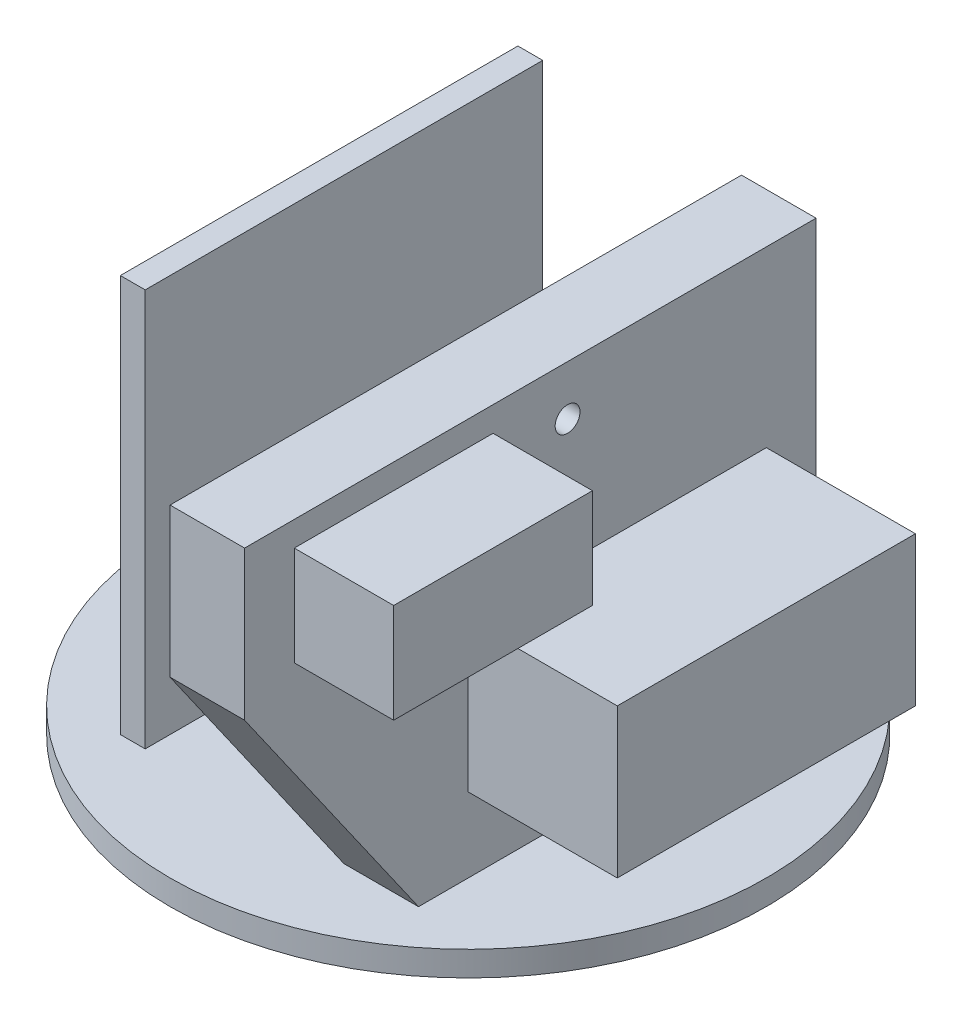
ISO-10303-21;
HEADER;
FILE_DESCRIPTION(('STEP AP214'),'2;1');
FILE_NAME('part.step','',(''),(''),'','','');
FILE_SCHEMA(('AUTOMOTIVE_DESIGN { 1 0 10303 214 1 1 1 1 }'));
ENDSEC;
DATA;
#1=APPLICATION_CONTEXT('core data for automotive mechanical design processes');
#2=APPLICATION_PROTOCOL_DEFINITION('international standard','automotive_design',2000,#1);
#3=PRODUCT_CONTEXT('',#1,'mechanical');
#4=PRODUCT('Part','Part','',(#3));
#5=PRODUCT_RELATED_PRODUCT_CATEGORY('part','',(#4));
#6=PRODUCT_DEFINITION_FORMATION('','',#4);
#7=PRODUCT_DEFINITION_CONTEXT('part definition',#1,'design');
#8=PRODUCT_DEFINITION('design','',#6,#7);
#9=PRODUCT_DEFINITION_SHAPE('','',#8);
#10=(LENGTH_UNIT() NAMED_UNIT(*) SI_UNIT(.MILLI.,.METRE.));
#11=(NAMED_UNIT(*) PLANE_ANGLE_UNIT() SI_UNIT($,.RADIAN.));
#12=(NAMED_UNIT(*) SI_UNIT($,.STERADIAN.) SOLID_ANGLE_UNIT());
#13=UNCERTAINTY_MEASURE_WITH_UNIT(LENGTH_MEASURE(1.E-05),#10,'distance_accuracy_value','');
#14=(GEOMETRIC_REPRESENTATION_CONTEXT(3) GLOBAL_UNCERTAINTY_ASSIGNED_CONTEXT((#13)) GLOBAL_UNIT_ASSIGNED_CONTEXT((#10,
#11,#12)) REPRESENTATION_CONTEXT('',''));
#15=CARTESIAN_POINT('',(0.,0.,0.));
#16=DIRECTION('',(0.,0.,1.));
#17=DIRECTION('',(1.,0.,0.));
#18=AXIS2_PLACEMENT_3D('',#15,#16,#17);
#19=CARTESIAN_POINT('',(15.,69.9999999999999,55.));
#20=DIRECTION('',(-1.,0.,0.));
#21=DIRECTION('',(0.,0.,1.));
#22=AXIS2_PLACEMENT_3D('',#19,#20,#21);
#23=CYLINDRICAL_SURFACE('',#22,2.5);
#24=CARTESIAN_POINT('',(15.,69.9999999999999,55.));
#25=DIRECTION('',(1.,0.,0.));
#26=DIRECTION('',(0.,0.,-1.));
#27=AXIS2_PLACEMENT_3D('',#24,#25,#26);
#28=CIRCLE('',#27,2.5);
#29=CARTESIAN_POINT('',(15.,69.9999999999999,52.5));
#30=VERTEX_POINT('',#29);
#31=EDGE_CURVE('P0_E11',#30,#30,#28,.T.);
#32=ORIENTED_EDGE('',*,*,#31,.F.);
#33=EDGE_LOOP('',(#32));
#34=FACE_BOUND('',#33,.T.);
#35=CARTESIAN_POINT('',(5.,69.9999999999999,55.));
#36=DIRECTION('',(1.,0.,0.));
#37=DIRECTION('',(0.,0.,-1.));
#38=AXIS2_PLACEMENT_3D('',#35,#36,#37);
#39=CIRCLE('',#38,2.5);
#40=CARTESIAN_POINT('',(5.,69.9999999999999,52.5));
#41=VERTEX_POINT('',#40);
#42=EDGE_CURVE('P0_E19',#41,#41,#39,.T.);
#43=ORIENTED_EDGE('',*,*,#42,.T.);
#44=EDGE_LOOP('',(#43));
#45=FACE_BOUND('',#44,.T.);
#46=ADVANCED_FACE('P0_F16',(#34,#45),#23,.T.);
#47=CARTESIAN_POINT('',(5.,69.9999999999999,55.));
#48=DIRECTION('',(1.,0.,0.));
#49=DIRECTION('',(0.,0.,-1.));
#50=AXIS2_PLACEMENT_3D('',#47,#48,#49);
#51=PLANE('',#50);
#52=ORIENTED_EDGE('',*,*,#42,.F.);
#53=EDGE_LOOP('',(#52));
#54=FACE_BOUND('',#53,.T.);
#55=ADVANCED_FACE('P0_F95',(#54),#51,.F.);
#56=CARTESIAN_POINT('',(50.,79.9999999999999,65.));
#57=DIRECTION('',(0.,-1.,0.));
#58=DIRECTION('',(0.,0.,-1.));
#59=AXIS2_PLACEMENT_3D('',#56,#57,#58);
#60=PLANE('',#59);
#61=DIRECTION('',(0.,0.,1.));
#62=VECTOR('',#61,1.);
#63=CARTESIAN_POINT('',(15.,79.9999999999999,65.));
#64=LINE('',#63,#62);
#65=CARTESIAN_POINT('',(15.,79.9999999999999,25.));
#66=VERTEX_POINT('',#65);
#67=CARTESIAN_POINT('',(15.,79.9999999999999,65.));
#68=VERTEX_POINT('',#67);
#69=EDGE_CURVE('P0_E83',#66,#68,#64,.T.);
#70=ORIENTED_EDGE('',*,*,#69,.T.);
#71=DIRECTION('',(-1.,0.,0.));
#72=VECTOR('',#71,1.);
#73=CARTESIAN_POINT('',(50.,79.9999999999999,65.));
#74=LINE('',#73,#72);
#75=CARTESIAN_POINT('',(50.,79.9999999999999,65.));
#76=VERTEX_POINT('',#75);
#77=EDGE_CURVE('P0_E74',#76,#68,#74,.T.);
#78=ORIENTED_EDGE('',*,*,#77,.F.);
#79=DIRECTION('',(0.,0.,1.));
#80=VECTOR('',#79,1.);
#81=CARTESIAN_POINT('',(50.,79.9999999999999,65.));
#82=LINE('',#81,#80);
#83=CARTESIAN_POINT('',(50.,79.9999999999999,25.));
#84=VERTEX_POINT('',#83);
#85=EDGE_CURVE('P0_E68',#84,#76,#82,.T.);
#86=ORIENTED_EDGE('',*,*,#85,.F.);
#87=DIRECTION('',(-1.,0.,0.));
#88=VECTOR('',#87,1.);
#89=CARTESIAN_POINT('',(50.,79.9999999999999,25.));
#90=LINE('',#89,#88);
#91=EDGE_CURVE('P0_E79',#84,#66,#90,.T.);
#92=ORIENTED_EDGE('',*,*,#91,.T.);
#93=EDGE_LOOP('',(#70,#78,#86,#92));
#94=FACE_BOUND('',#93,.T.);
#95=ADVANCED_FACE('P0_F97',(#94),#60,.F.);
#96=CARTESIAN_POINT('',(50.,79.9999999999999,65.));
#97=DIRECTION('',(0.,0.,-1.));
#98=DIRECTION('',(0.,1.,0.));
#99=AXIS2_PLACEMENT_3D('',#96,#97,#98);
#100=PLANE('',#99);
#101=DIRECTION('',(0.,-1.,0.));
#102=VECTOR('',#101,1.);
#103=CARTESIAN_POINT('',(15.,79.9999999999999,65.));
#104=LINE('',#103,#102);
#105=CARTESIAN_POINT('',(15.,59.9999999999999,65.));
#106=VERTEX_POINT('',#105);
#107=EDGE_CURVE('P0_E73',#68,#106,#104,.T.);
#108=ORIENTED_EDGE('',*,*,#107,.T.);
#109=DIRECTION('',(-1.,0.,0.));
#110=VECTOR('',#109,1.);
#111=CARTESIAN_POINT('',(50.,59.9999999999999,65.));
#112=LINE('',#111,#110);
#113=CARTESIAN_POINT('',(50.,59.9999999999999,65.));
#114=VERTEX_POINT('',#113);
#115=EDGE_CURVE('P0_E71',#114,#106,#112,.T.);
#116=ORIENTED_EDGE('',*,*,#115,.F.);
#117=DIRECTION('',(0.,-1.,0.));
#118=VECTOR('',#117,1.);
#119=CARTESIAN_POINT('',(50.,79.9999999999999,65.));
#120=LINE('',#119,#118);
#121=EDGE_CURVE('P0_E63',#76,#114,#120,.T.);
#122=ORIENTED_EDGE('',*,*,#121,.F.);
#123=ORIENTED_EDGE('',*,*,#77,.T.);
#124=EDGE_LOOP('',(#108,#116,#122,#123));
#125=FACE_BOUND('',#124,.T.);
#126=ADVANCED_FACE('P0_F72',(#125),#100,.F.);
#127=CARTESIAN_POINT('',(50.,59.9999999999999,65.));
#128=DIRECTION('',(0.,1.,0.));
#129=DIRECTION('',(0.,0.,1.));
#130=AXIS2_PLACEMENT_3D('',#127,#128,#129);
#131=PLANE('',#130);
#132=DIRECTION('',(0.,0.,-1.));
#133=VECTOR('',#132,1.);
#134=CARTESIAN_POINT('',(15.,59.9999999999999,65.));
#135=LINE('',#134,#133);
#136=CARTESIAN_POINT('',(15.,59.9999999999999,25.));
#137=VERTEX_POINT('',#136);
#138=EDGE_CURVE('P0_E49',#106,#137,#135,.T.);
#139=ORIENTED_EDGE('',*,*,#138,.T.);
#140=DIRECTION('',(-1.,0.,0.));
#141=VECTOR('',#140,1.);
#142=CARTESIAN_POINT('',(50.,59.9999999999999,25.));
#143=LINE('',#142,#141);
#144=CARTESIAN_POINT('',(50.,59.9999999999999,25.));
#145=VERTEX_POINT('',#144);
#146=EDGE_CURVE('P0_E75',#145,#137,#143,.T.);
#147=ORIENTED_EDGE('',*,*,#146,.F.);
#148=DIRECTION('',(0.,0.,-1.));
#149=VECTOR('',#148,1.);
#150=CARTESIAN_POINT('',(50.,59.9999999999999,65.));
#151=LINE('',#150,#149);
#152=EDGE_CURVE('P0_E66',#114,#145,#151,.T.);
#153=ORIENTED_EDGE('',*,*,#152,.F.);
#154=ORIENTED_EDGE('',*,*,#115,.T.);
#155=EDGE_LOOP('',(#139,#147,#153,#154));
#156=FACE_BOUND('',#155,.T.);
#157=ADVANCED_FACE('P0_F77',(#156),#131,.F.);
#158=CARTESIAN_POINT('',(50.,79.9999999999999,25.));
#159=DIRECTION('',(0.,0.,1.));
#160=DIRECTION('',(0.,-1.,0.));
#161=AXIS2_PLACEMENT_3D('',#158,#159,#160);
#162=PLANE('',#161);
#163=DIRECTION('',(0.,1.,0.));
#164=VECTOR('',#163,1.);
#165=CARTESIAN_POINT('',(15.,79.9999999999999,25.));
#166=LINE('',#165,#164);
#167=EDGE_CURVE('P0_E55',#137,#66,#166,.T.);
#168=ORIENTED_EDGE('',*,*,#167,.T.);
#169=ORIENTED_EDGE('',*,*,#91,.F.);
#170=DIRECTION('',(0.,1.,0.));
#171=VECTOR('',#170,1.);
#172=CARTESIAN_POINT('',(50.,79.9999999999999,25.));
#173=LINE('',#172,#171);
#174=EDGE_CURVE('P0_E32',#145,#84,#173,.T.);
#175=ORIENTED_EDGE('',*,*,#174,.F.);
#176=ORIENTED_EDGE('',*,*,#146,.T.);
#177=EDGE_LOOP('',(#168,#169,#175,#176));
#178=FACE_BOUND('',#177,.T.);
#179=ADVANCED_FACE('P0_F111',(#178),#162,.F.);
#180=CARTESIAN_POINT('',(50.,69.9999999999999,55.));
#181=DIRECTION('',(-1.,0.,0.));
#182=DIRECTION('',(0.,0.,1.));
#183=AXIS2_PLACEMENT_3D('',#180,#181,#182);
#184=PLANE('',#183);
#185=ORIENTED_EDGE('',*,*,#85,.T.);
#186=ORIENTED_EDGE('',*,*,#121,.T.);
#187=ORIENTED_EDGE('',*,*,#152,.T.);
#188=ORIENTED_EDGE('',*,*,#174,.T.);
#189=EDGE_LOOP('',(#185,#186,#187,#188));
#190=FACE_BOUND('',#189,.T.);
#191=ADVANCED_FACE('P0_F64',(#190),#184,.F.);
#192=CARTESIAN_POINT('',(15.,69.9999999999999,55.));
#193=DIRECTION('',(-1.,0.,0.));
#194=DIRECTION('',(0.,0.,1.));
#195=AXIS2_PLACEMENT_3D('',#192,#193,#194);
#196=PLANE('',#195);
#197=ORIENTED_EDGE('',*,*,#31,.T.);
#198=EDGE_LOOP('',(#197));
#199=FACE_BOUND('',#198,.T.);
#200=ORIENTED_EDGE('',*,*,#69,.F.);
#201=ORIENTED_EDGE('',*,*,#167,.F.);
#202=ORIENTED_EDGE('',*,*,#138,.F.);
#203=ORIENTED_EDGE('',*,*,#107,.F.);
#204=EDGE_LOOP('',(#200,#201,#202,#203));
#205=FACE_BOUND('',#204,.T.);
#206=ADVANCED_FACE('P0_F114',(#199,#205),#196,.T.);
#207=CLOSED_SHELL('',(#46,#55,#95,#126,#157,#179,#191,#206));
#208=MANIFOLD_SOLID_BREP('P0_B1',#207);
#209=CARTESIAN_POINT('',(-25.,5.,-40.));
#210=DIRECTION('',(0.,0.,1.));
#211=DIRECTION('',(1.,0.,0.));
#212=AXIS2_PLACEMENT_3D('',#209,#210,#211);
#213=PLANE('',#212);
#214=DIRECTION('',(0.,1.,0.));
#215=VECTOR('',#214,1.);
#216=CARTESIAN_POINT('',(-30.,5.,-40.));
#217=LINE('',#216,#215);
#218=CARTESIAN_POINT('',(-30.,5.,-40.));
#219=VERTEX_POINT('',#218);
#220=CARTESIAN_POINT('',(-30.,85.,-40.));
#221=VERTEX_POINT('',#220);
#222=EDGE_CURVE('P1_E79',#219,#221,#217,.T.);
#223=ORIENTED_EDGE('',*,*,#222,.T.);
#224=DIRECTION('',(-1.,0.,0.));
#225=VECTOR('',#224,1.);
#226=CARTESIAN_POINT('',(-25.,85.,-40.));
#227=LINE('',#226,#225);
#228=CARTESIAN_POINT('',(-25.,85.,-40.));
#229=VERTEX_POINT('',#228);
#230=EDGE_CURVE('P1_E11',#229,#221,#227,.T.);
#231=ORIENTED_EDGE('',*,*,#230,.F.);
#232=DIRECTION('',(0.,1.,0.));
#233=VECTOR('',#232,1.);
#234=CARTESIAN_POINT('',(-25.,5.,-40.));
#235=LINE('',#234,#233);
#236=CARTESIAN_POINT('',(-25.,5.,-40.));
#237=VERTEX_POINT('',#236);
#238=EDGE_CURVE('P1_E67',#237,#229,#235,.T.);
#239=ORIENTED_EDGE('',*,*,#238,.F.);
#240=DIRECTION('',(-1.,0.,0.));
#241=VECTOR('',#240,1.);
#242=CARTESIAN_POINT('',(-25.,5.,-40.));
#243=LINE('',#242,#241);
#244=EDGE_CURVE('P1_E75',#237,#219,#243,.T.);
#245=ORIENTED_EDGE('',*,*,#244,.T.);
#246=EDGE_LOOP('',(#223,#231,#239,#245));
#247=FACE_BOUND('',#246,.T.);
#248=ADVANCED_FACE('P1_F16',(#247),#213,.F.);
#249=CARTESIAN_POINT('',(-25.,85.,-40.));
#250=DIRECTION('',(0.,-1.,0.));
#251=DIRECTION('',(0.,0.,-1.));
#252=AXIS2_PLACEMENT_3D('',#249,#250,#251);
#253=PLANE('',#252);
#254=DIRECTION('',(0.,0.,1.));
#255=VECTOR('',#254,1.);
#256=CARTESIAN_POINT('',(-30.,85.,-40.));
#257=LINE('',#256,#255);
#258=CARTESIAN_POINT('',(-30.,85.,40.));
#259=VERTEX_POINT('',#258);
#260=EDGE_CURVE('P1_E71',#221,#259,#257,.T.);
#261=ORIENTED_EDGE('',*,*,#260,.T.);
#262=DIRECTION('',(-1.,0.,0.));
#263=VECTOR('',#262,1.);
#264=CARTESIAN_POINT('',(-25.,85.,40.));
#265=LINE('',#264,#263);
#266=CARTESIAN_POINT('',(-25.,85.,40.));
#267=VERTEX_POINT('',#266);
#268=EDGE_CURVE('P1_E24',#267,#259,#265,.T.);
#269=ORIENTED_EDGE('',*,*,#268,.F.);
#270=DIRECTION('',(0.,0.,1.));
#271=VECTOR('',#270,1.);
#272=CARTESIAN_POINT('',(-25.,85.,-40.));
#273=LINE('',#272,#271);
#274=EDGE_CURVE('P1_E62',#229,#267,#273,.T.);
#275=ORIENTED_EDGE('',*,*,#274,.F.);
#276=ORIENTED_EDGE('',*,*,#230,.T.);
#277=EDGE_LOOP('',(#261,#269,#275,#276));
#278=FACE_BOUND('',#277,.T.);
#279=ADVANCED_FACE('P1_F70',(#278),#253,.F.);
#280=CARTESIAN_POINT('',(-25.,4.99999999999999,40.));
#281=DIRECTION('',(0.,0.,-1.));
#282=DIRECTION('',(-1.,0.,0.));
#283=AXIS2_PLACEMENT_3D('',#280,#281,#282);
#284=PLANE('',#283);
#285=DIRECTION('',(0.,-1.,0.));
#286=VECTOR('',#285,1.);
#287=CARTESIAN_POINT('',(-30.,4.99999999999999,40.));
#288=LINE('',#287,#286);
#289=CARTESIAN_POINT('',(-30.,4.99999999999999,40.));
#290=VERTEX_POINT('',#289);
#291=EDGE_CURVE('P1_E49',#259,#290,#288,.T.);
#292=ORIENTED_EDGE('',*,*,#291,.T.);
#293=DIRECTION('',(-1.,0.,0.));
#294=VECTOR('',#293,1.);
#295=CARTESIAN_POINT('',(-25.,4.99999999999999,40.));
#296=LINE('',#295,#294);
#297=CARTESIAN_POINT('',(-25.,4.99999999999999,40.));
#298=VERTEX_POINT('',#297);
#299=EDGE_CURVE('P1_E72',#298,#290,#296,.T.);
#300=ORIENTED_EDGE('',*,*,#299,.F.);
#301=DIRECTION('',(0.,-1.,0.));
#302=VECTOR('',#301,1.);
#303=CARTESIAN_POINT('',(-25.,4.99999999999999,40.));
#304=LINE('',#303,#302);
#305=EDGE_CURVE('P1_E65',#267,#298,#304,.T.);
#306=ORIENTED_EDGE('',*,*,#305,.F.);
#307=ORIENTED_EDGE('',*,*,#268,.T.);
#308=EDGE_LOOP('',(#292,#300,#306,#307));
#309=FACE_BOUND('',#308,.T.);
#310=ADVANCED_FACE('P1_F73',(#309),#284,.F.);
#311=CARTESIAN_POINT('',(-25.,5.,-40.));
#312=DIRECTION('',(0.,1.,0.));
#313=DIRECTION('',(0.,0.,1.));
#314=AXIS2_PLACEMENT_3D('',#311,#312,#313);
#315=PLANE('',#314);
#316=DIRECTION('',(0.,0.,-1.));
#317=VECTOR('',#316,1.);
#318=CARTESIAN_POINT('',(-30.,5.,-40.));
#319=LINE('',#318,#317);
#320=EDGE_CURVE('P1_E55',#290,#219,#319,.T.);
#321=ORIENTED_EDGE('',*,*,#320,.T.);
#322=ORIENTED_EDGE('',*,*,#244,.F.);
#323=DIRECTION('',(0.,0.,-1.));
#324=VECTOR('',#323,1.);
#325=CARTESIAN_POINT('',(-25.,5.,-40.));
#326=LINE('',#325,#324);
#327=EDGE_CURVE('P1_E32',#298,#237,#326,.T.);
#328=ORIENTED_EDGE('',*,*,#327,.F.);
#329=ORIENTED_EDGE('',*,*,#299,.T.);
#330=EDGE_LOOP('',(#321,#322,#328,#329));
#331=FACE_BOUND('',#330,.T.);
#332=ADVANCED_FACE('P1_F86',(#331),#315,.F.);
#333=CARTESIAN_POINT('',(-25.,5.,-40.));
#334=DIRECTION('',(1.,0.,0.));
#335=DIRECTION('',(0.,0.,-1.));
#336=AXIS2_PLACEMENT_3D('',#333,#334,#335);
#337=PLANE('',#336);
#338=ORIENTED_EDGE('',*,*,#238,.T.);
#339=ORIENTED_EDGE('',*,*,#274,.T.);
#340=ORIENTED_EDGE('',*,*,#305,.T.);
#341=ORIENTED_EDGE('',*,*,#327,.T.);
#342=EDGE_LOOP('',(#338,#339,#340,#341));
#343=FACE_BOUND('',#342,.T.);
#344=ADVANCED_FACE('P1_F63',(#343),#337,.T.);
#345=CARTESIAN_POINT('',(-30.,5.,-40.));
#346=DIRECTION('',(1.,0.,0.));
#347=DIRECTION('',(0.,0.,-1.));
#348=AXIS2_PLACEMENT_3D('',#345,#346,#347);
#349=PLANE('',#348);
#350=ORIENTED_EDGE('',*,*,#222,.F.);
#351=ORIENTED_EDGE('',*,*,#320,.F.);
#352=ORIENTED_EDGE('',*,*,#291,.F.);
#353=ORIENTED_EDGE('',*,*,#260,.F.);
#354=EDGE_LOOP('',(#350,#351,#352,#353));
#355=FACE_BOUND('',#354,.T.);
#356=ADVANCED_FACE('P1_F89',(#355),#349,.F.);
#357=CLOSED_SHELL('',(#248,#279,#310,#332,#344,#356));
#358=MANIFOLD_SOLID_BREP('P1_B1',#357);
#359=CARTESIAN_POINT('',(30.,5.,-40.));
#360=DIRECTION('',(-1.,0.,0.));
#361=DIRECTION('',(0.,0.,1.));
#362=AXIS2_PLACEMENT_3D('',#359,#360,#361);
#363=PLANE('',#362);
#364=CARTESIAN_POINT('',(30.,75.,9.99999999999999));
#365=DIRECTION('',(1.,0.,0.));
#366=DIRECTION('',(0.,0.,-1.));
#367=AXIS2_PLACEMENT_3D('',#364,#365,#366);
#368=CIRCLE('',#367,2.5);
#369=CARTESIAN_POINT('',(30.,75.,7.49999999999999));
#370=VERTEX_POINT('',#369);
#371=EDGE_CURVE('P2_E391',#370,#370,#368,.T.);
#372=ORIENTED_EDGE('',*,*,#371,.F.);
#373=EDGE_LOOP('',(#372));
#374=FACE_BOUND('',#373,.T.);
#375=DIRECTION('',(0.,-1.,0.));
#376=VECTOR('',#375,1.);
#377=CARTESIAN_POINT('',(30.,80.,65.));
#378=LINE('',#377,#376);
#379=CARTESIAN_POINT('',(30.,80.,65.));
#380=VERTEX_POINT('',#379);
#381=CARTESIAN_POINT('',(30.,60.,65.));
#382=VERTEX_POINT('',#381);
#383=EDGE_CURVE('P2_E149',#380,#382,#378,.T.);
#384=ORIENTED_EDGE('',*,*,#383,.F.);
#385=DIRECTION('',(0.,0.,1.));
#386=VECTOR('',#385,1.);
#387=CARTESIAN_POINT('',(30.,80.,65.));
#388=LINE('',#387,#386);
#389=CARTESIAN_POINT('',(30.,80.,25.));
#390=VERTEX_POINT('',#389);
#391=EDGE_CURVE('P2_E157',#390,#380,#388,.T.);
#392=ORIENTED_EDGE('',*,*,#391,.F.);
#393=DIRECTION('',(0.,1.,0.));
#394=VECTOR('',#393,1.);
#395=CARTESIAN_POINT('',(30.,80.,25.));
#396=LINE('',#395,#394);
#397=CARTESIAN_POINT('',(30.,60.,25.));
#398=VERTEX_POINT('',#397);
#399=EDGE_CURVE('P2_E154',#398,#390,#396,.T.);
#400=ORIENTED_EDGE('',*,*,#399,.F.);
#401=DIRECTION('',(0.,0.,-1.));
#402=VECTOR('',#401,1.);
#403=CARTESIAN_POINT('',(30.,60.,65.));
#404=LINE('',#403,#402);
#405=EDGE_CURVE('P2_E151',#382,#398,#404,.T.);
#406=ORIENTED_EDGE('',*,*,#405,.F.);
#407=EDGE_LOOP('',(#384,#392,#400,#406));
#408=FACE_BOUND('',#407,.T.);
#409=DIRECTION('',(0.,1.,0.));
#410=VECTOR('',#409,1.);
#411=CARTESIAN_POINT('',(30.,85.,-40.));
#412=LINE('',#411,#410);
#413=CARTESIAN_POINT('',(30.,5.,-40.));
#414=VERTEX_POINT('',#413);
#415=CARTESIAN_POINT('',(30.,85.,-40.));
#416=VERTEX_POINT('',#415);
#417=EDGE_CURVE('P2_E180',#414,#416,#412,.T.);
#418=ORIENTED_EDGE('',*,*,#417,.T.);
#419=DIRECTION('',(0.,0.,1.));
#420=VECTOR('',#419,1.);
#421=CARTESIAN_POINT('',(30.,85.,-40.));
#422=LINE('',#421,#420);
#423=CARTESIAN_POINT('',(30.,85.,75.));
#424=VERTEX_POINT('',#423);
#425=EDGE_CURVE('P2_E183',#416,#424,#422,.T.);
#426=ORIENTED_EDGE('',*,*,#425,.T.);
#427=DIRECTION('',(0.,-1.,0.));
#428=VECTOR('',#427,1.);
#429=CARTESIAN_POINT('',(30.,85.,75.));
#430=LINE('',#429,#428);
#431=CARTESIAN_POINT('',(30.,55.,75.));
#432=VERTEX_POINT('',#431);
#433=EDGE_CURVE('P2_E186',#424,#432,#430,.T.);
#434=ORIENTED_EDGE('',*,*,#433,.T.);
#435=DIRECTION('',(0.,-0.81923192051904,-0.573462344363328));
#436=VECTOR('',#435,1.);
#437=CARTESIAN_POINT('',(30.,55.,75.));
#438=LINE('',#437,#436);
#439=CARTESIAN_POINT('',(30.,4.99999999999998,40.));
#440=VERTEX_POINT('',#439);
#441=EDGE_CURVE('P2_E188',#432,#440,#438,.T.);
#442=ORIENTED_EDGE('',*,*,#441,.T.);
#443=DIRECTION('',(0.,0.,-1.));
#444=VECTOR('',#443,1.);
#445=CARTESIAN_POINT('',(30.,5.,-40.));
#446=LINE('',#445,#444);
#447=EDGE_CURVE('P2_E190',#440,#414,#446,.T.);
#448=ORIENTED_EDGE('',*,*,#447,.T.);
#449=EDGE_LOOP('',(#418,#426,#434,#442,#448));
#450=FACE_BOUND('',#449,.T.);
#451=DIRECTION('',(0.,-1.,0.));
#452=VECTOR('',#451,1.);
#453=CARTESIAN_POINT('',(30.,50.,30.));
#454=LINE('',#453,#452);
#455=CARTESIAN_POINT('',(30.,50.,30.));
#456=VERTEX_POINT('',#455);
#457=CARTESIAN_POINT('',(30.,20.,30.));
#458=VERTEX_POINT('',#457);
#459=EDGE_CURVE('P2_E111',#456,#458,#454,.T.);
#460=ORIENTED_EDGE('',*,*,#459,.F.);
#461=DIRECTION('',(0.,0.,1.));
#462=VECTOR('',#461,1.);
#463=CARTESIAN_POINT('',(30.,50.,30.));
#464=LINE('',#463,#462);
#465=CARTESIAN_POINT('',(30.,50.,-30.));
#466=VERTEX_POINT('',#465);
#467=EDGE_CURVE('P2_E133',#466,#456,#464,.T.);
#468=ORIENTED_EDGE('',*,*,#467,.F.);
#469=DIRECTION('',(0.,1.,0.));
#470=VECTOR('',#469,1.);
#471=CARTESIAN_POINT('',(30.,50.,-30.));
#472=LINE('',#471,#470);
#473=CARTESIAN_POINT('',(30.,20.,-30.));
#474=VERTEX_POINT('',#473);
#475=EDGE_CURVE('P2_E131',#474,#466,#472,.T.);
#476=ORIENTED_EDGE('',*,*,#475,.F.);
#477=DIRECTION('',(0.,0.,-1.));
#478=VECTOR('',#477,1.);
#479=CARTESIAN_POINT('',(30.,20.,30.));
#480=LINE('',#479,#478);
#481=EDGE_CURVE('P2_E119',#458,#474,#480,.T.);
#482=ORIENTED_EDGE('',*,*,#481,.F.);
#483=EDGE_LOOP('',(#460,#468,#476,#482));
#484=FACE_BOUND('',#483,.T.);
#485=ADVANCED_FACE('P2_F16',(#374,#408,#450,#484),#363,.F.);
#486=CARTESIAN_POINT('',(15.,5.,-40.));
#487=DIRECTION('',(-1.,0.,0.));
#488=DIRECTION('',(0.,0.,1.));
#489=AXIS2_PLACEMENT_3D('',#486,#487,#488);
#490=PLANE('',#489);
#491=CARTESIAN_POINT('',(15.,75.,9.99999999999999));
#492=DIRECTION('',(1.,0.,0.));
#493=DIRECTION('',(0.,0.,-1.));
#494=AXIS2_PLACEMENT_3D('',#491,#492,#493);
#495=CIRCLE('',#494,2.5);
#496=CARTESIAN_POINT('',(15.,75.,7.49999999999999));
#497=VERTEX_POINT('',#496);
#498=EDGE_CURVE('P2_E139',#497,#497,#495,.T.);
#499=ORIENTED_EDGE('',*,*,#498,.T.);
#500=EDGE_LOOP('',(#499));
#501=FACE_BOUND('',#500,.T.);
#502=DIRECTION('',(0.,1.,0.));
#503=VECTOR('',#502,1.);
#504=CARTESIAN_POINT('',(15.,85.,-40.));
#505=LINE('',#504,#503);
#506=CARTESIAN_POINT('',(15.,5.,-40.));
#507=VERTEX_POINT('',#506);
#508=CARTESIAN_POINT('',(15.,85.,-40.));
#509=VERTEX_POINT('',#508);
#510=EDGE_CURVE('P2_E179',#507,#509,#505,.T.);
#511=ORIENTED_EDGE('',*,*,#510,.F.);
#512=DIRECTION('',(0.,0.,-1.));
#513=VECTOR('',#512,1.);
#514=CARTESIAN_POINT('',(15.,5.,-40.));
#515=LINE('',#514,#513);
#516=CARTESIAN_POINT('',(15.,4.99999999999998,40.));
#517=VERTEX_POINT('',#516);
#518=EDGE_CURVE('P2_E184',#517,#507,#515,.T.);
#519=ORIENTED_EDGE('',*,*,#518,.F.);
#520=DIRECTION('',(0.,-0.81923192051904,-0.573462344363328));
#521=VECTOR('',#520,1.);
#522=CARTESIAN_POINT('',(15.,55.,75.));
#523=LINE('',#522,#521);
#524=CARTESIAN_POINT('',(15.,55.,75.));
#525=VERTEX_POINT('',#524);
#526=EDGE_CURVE('P2_E199',#525,#517,#523,.T.);
#527=ORIENTED_EDGE('',*,*,#526,.F.);
#528=DIRECTION('',(0.,-1.,0.));
#529=VECTOR('',#528,1.);
#530=CARTESIAN_POINT('',(15.,85.,75.));
#531=LINE('',#530,#529);
#532=CARTESIAN_POINT('',(15.,85.,75.));
#533=VERTEX_POINT('',#532);
#534=EDGE_CURVE('P2_E197',#533,#525,#531,.T.);
#535=ORIENTED_EDGE('',*,*,#534,.F.);
#536=DIRECTION('',(0.,0.,1.));
#537=VECTOR('',#536,1.);
#538=CARTESIAN_POINT('',(15.,85.,-40.));
#539=LINE('',#538,#537);
#540=EDGE_CURVE('P2_E195',#509,#533,#539,.T.);
#541=ORIENTED_EDGE('',*,*,#540,.F.);
#542=EDGE_LOOP('',(#511,#519,#527,#535,#541));
#543=FACE_BOUND('',#542,.T.);
#544=DIRECTION('',(0.,0.,1.));
#545=VECTOR('',#544,1.);
#546=CARTESIAN_POINT('',(15.,80.,65.));
#547=LINE('',#546,#545);
#548=CARTESIAN_POINT('',(15.,80.,25.));
#549=VERTEX_POINT('',#548);
#550=CARTESIAN_POINT('',(15.,80.,65.));
#551=VERTEX_POINT('',#550);
#552=EDGE_CURVE('P2_E152',#549,#551,#547,.T.);
#553=ORIENTED_EDGE('',*,*,#552,.T.);
#554=DIRECTION('',(0.,-1.,0.));
#555=VECTOR('',#554,1.);
#556=CARTESIAN_POINT('',(15.,80.,65.));
#557=LINE('',#556,#555);
#558=CARTESIAN_POINT('',(15.,60.,65.));
#559=VERTEX_POINT('',#558);
#560=EDGE_CURVE('P2_E127',#551,#559,#557,.T.);
#561=ORIENTED_EDGE('',*,*,#560,.T.);
#562=DIRECTION('',(0.,0.,-1.));
#563=VECTOR('',#562,1.);
#564=CARTESIAN_POINT('',(15.,60.,65.));
#565=LINE('',#564,#563);
#566=CARTESIAN_POINT('',(15.,60.,25.));
#567=VERTEX_POINT('',#566);
#568=EDGE_CURVE('P2_E162',#559,#567,#565,.T.);
#569=ORIENTED_EDGE('',*,*,#568,.T.);
#570=DIRECTION('',(0.,1.,0.));
#571=VECTOR('',#570,1.);
#572=CARTESIAN_POINT('',(15.,80.,25.));
#573=LINE('',#572,#571);
#574=EDGE_CURVE('P2_E165',#567,#549,#573,.T.);
#575=ORIENTED_EDGE('',*,*,#574,.T.);
#576=EDGE_LOOP('',(#553,#561,#569,#575));
#577=FACE_BOUND('',#576,.T.);
#578=DIRECTION('',(0.,0.,1.));
#579=VECTOR('',#578,1.);
#580=CARTESIAN_POINT('',(15.,50.,30.));
#581=LINE('',#580,#579);
#582=CARTESIAN_POINT('',(15.,50.,-30.));
#583=VERTEX_POINT('',#582);
#584=CARTESIAN_POINT('',(15.,50.,30.));
#585=VERTEX_POINT('',#584);
#586=EDGE_CURVE('P2_E120',#583,#585,#581,.T.);
#587=ORIENTED_EDGE('',*,*,#586,.T.);
#588=DIRECTION('',(0.,-1.,0.));
#589=VECTOR('',#588,1.);
#590=CARTESIAN_POINT('',(15.,50.,30.));
#591=LINE('',#590,#589);
#592=CARTESIAN_POINT('',(15.,20.,30.));
#593=VERTEX_POINT('',#592);
#594=EDGE_CURVE('P2_E39',#585,#593,#591,.T.);
#595=ORIENTED_EDGE('',*,*,#594,.T.);
#596=DIRECTION('',(0.,0.,-1.));
#597=VECTOR('',#596,1.);
#598=CARTESIAN_POINT('',(15.,20.,30.));
#599=LINE('',#598,#597);
#600=CARTESIAN_POINT('',(15.,20.,-30.));
#601=VERTEX_POINT('',#600);
#602=EDGE_CURVE('P2_E126',#593,#601,#599,.T.);
#603=ORIENTED_EDGE('',*,*,#602,.T.);
#604=DIRECTION('',(0.,1.,0.));
#605=VECTOR('',#604,1.);
#606=CARTESIAN_POINT('',(15.,50.,-30.));
#607=LINE('',#606,#605);
#608=EDGE_CURVE('P2_E141',#601,#583,#607,.T.);
#609=ORIENTED_EDGE('',*,*,#608,.T.);
#610=EDGE_LOOP('',(#587,#595,#603,#609));
#611=FACE_BOUND('',#610,.T.);
#612=ADVANCED_FACE('P2_F220',(#501,#543,#577,#611),#490,.T.);
#613=CARTESIAN_POINT('',(30.,85.,-40.));
#614=DIRECTION('',(0.,0.,1.));
#615=DIRECTION('',(1.,0.,0.));
#616=AXIS2_PLACEMENT_3D('',#613,#614,#615);
#617=PLANE('',#616);
#618=ORIENTED_EDGE('',*,*,#510,.T.);
#619=DIRECTION('',(-1.,0.,0.));
#620=VECTOR('',#619,1.);
#621=CARTESIAN_POINT('',(30.,85.,-40.));
#622=LINE('',#621,#620);
#623=EDGE_CURVE('P2_E11',#416,#509,#622,.T.);
#624=ORIENTED_EDGE('',*,*,#623,.F.);
#625=ORIENTED_EDGE('',*,*,#417,.F.);
#626=DIRECTION('',(-1.,0.,0.));
#627=VECTOR('',#626,1.);
#628=CARTESIAN_POINT('',(30.,5.,-40.));
#629=LINE('',#628,#627);
#630=EDGE_CURVE('P2_E192',#414,#507,#629,.T.);
#631=ORIENTED_EDGE('',*,*,#630,.T.);
#632=EDGE_LOOP('',(#618,#624,#625,#631));
#633=FACE_BOUND('',#632,.T.);
#634=ADVANCED_FACE('P2_F18',(#633),#617,.F.);
#635=CARTESIAN_POINT('',(30.,85.,-40.));
#636=DIRECTION('',(0.,-1.,0.));
#637=DIRECTION('',(0.,0.,-1.));
#638=AXIS2_PLACEMENT_3D('',#635,#636,#637);
#639=PLANE('',#638);
#640=ORIENTED_EDGE('',*,*,#540,.T.);
#641=DIRECTION('',(-1.,0.,0.));
#642=VECTOR('',#641,1.);
#643=CARTESIAN_POINT('',(30.,85.,75.));
#644=LINE('',#643,#642);
#645=EDGE_CURVE('P2_E24',#424,#533,#644,.T.);
#646=ORIENTED_EDGE('',*,*,#645,.F.);
#647=ORIENTED_EDGE('',*,*,#425,.F.);
#648=ORIENTED_EDGE('',*,*,#623,.T.);
#649=EDGE_LOOP('',(#640,#646,#647,#648));
#650=FACE_BOUND('',#649,.T.);
#651=ADVANCED_FACE('P2_F234',(#650),#639,.F.);
#652=CARTESIAN_POINT('',(30.,85.,75.));
#653=DIRECTION('',(0.,0.,-1.));
#654=DIRECTION('',(-1.,0.,0.));
#655=AXIS2_PLACEMENT_3D('',#652,#653,#654);
#656=PLANE('',#655);
#657=ORIENTED_EDGE('',*,*,#534,.T.);
#658=DIRECTION('',(-1.,0.,0.));
#659=VECTOR('',#658,1.);
#660=CARTESIAN_POINT('',(30.,55.,75.));
#661=LINE('',#660,#659);
#662=EDGE_CURVE('P2_E207',#432,#525,#661,.T.);
#663=ORIENTED_EDGE('',*,*,#662,.F.);
#664=ORIENTED_EDGE('',*,*,#433,.F.);
#665=ORIENTED_EDGE('',*,*,#645,.T.);
#666=EDGE_LOOP('',(#657,#663,#664,#665));
#667=FACE_BOUND('',#666,.T.);
#668=ADVANCED_FACE('P2_F214',(#667),#656,.F.);
#669=CARTESIAN_POINT('',(30.,55.,75.));
#670=DIRECTION('',(0.,0.573462344363328,-0.81923192051904));
#671=DIRECTION('',(0.,0.81923192051904,0.573462344363328));
#672=AXIS2_PLACEMENT_3D('',#669,#670,#671);
#673=PLANE('',#672);
#674=ORIENTED_EDGE('',*,*,#526,.T.);
#675=DIRECTION('',(-1.,0.,0.));
#676=VECTOR('',#675,1.);
#677=CARTESIAN_POINT('',(30.,4.99999999999998,40.));
#678=LINE('',#677,#676);
#679=EDGE_CURVE('P2_E204',#440,#517,#678,.T.);
#680=ORIENTED_EDGE('',*,*,#679,.F.);
#681=ORIENTED_EDGE('',*,*,#441,.F.);
#682=ORIENTED_EDGE('',*,*,#662,.T.);
#683=EDGE_LOOP('',(#674,#680,#681,#682));
#684=FACE_BOUND('',#683,.T.);
#685=ADVANCED_FACE('P2_F225',(#684),#673,.F.);
#686=CARTESIAN_POINT('',(30.,5.,-40.));
#687=DIRECTION('',(0.,1.,0.));
#688=DIRECTION('',(0.,0.,1.));
#689=AXIS2_PLACEMENT_3D('',#686,#687,#688);
#690=PLANE('',#689);
#691=ORIENTED_EDGE('',*,*,#518,.T.);
#692=ORIENTED_EDGE('',*,*,#630,.F.);
#693=ORIENTED_EDGE('',*,*,#447,.F.);
#694=ORIENTED_EDGE('',*,*,#679,.T.);
#695=EDGE_LOOP('',(#691,#692,#693,#694));
#696=FACE_BOUND('',#695,.T.);
#697=ADVANCED_FACE('P2_F229',(#696),#690,.F.);
#698=CARTESIAN_POINT('',(30.,80.,65.));
#699=DIRECTION('',(0.,0.,-1.));
#700=DIRECTION('',(0.,1.,0.));
#701=AXIS2_PLACEMENT_3D('',#698,#699,#700);
#702=PLANE('',#701);
#703=ORIENTED_EDGE('',*,*,#560,.F.);
#704=DIRECTION('',(-1.,0.,0.));
#705=VECTOR('',#704,1.);
#706=CARTESIAN_POINT('',(30.,80.,65.));
#707=LINE('',#706,#705);
#708=EDGE_CURVE('P2_E159',#380,#551,#707,.T.);
#709=ORIENTED_EDGE('',*,*,#708,.F.);
#710=ORIENTED_EDGE('',*,*,#383,.T.);
#711=DIRECTION('',(-1.,0.,0.));
#712=VECTOR('',#711,1.);
#713=CARTESIAN_POINT('',(30.,60.,65.));
#714=LINE('',#713,#712);
#715=EDGE_CURVE('P2_E176',#382,#559,#714,.T.);
#716=ORIENTED_EDGE('',*,*,#715,.T.);
#717=EDGE_LOOP('',(#703,#709,#710,#716));
#718=FACE_BOUND('',#717,.T.);
#719=ADVANCED_FACE('P2_F252',(#718),#702,.T.);
#720=CARTESIAN_POINT('',(30.,60.,65.));
#721=DIRECTION('',(0.,1.,0.));
#722=DIRECTION('',(0.,0.,1.));
#723=AXIS2_PLACEMENT_3D('',#720,#721,#722);
#724=PLANE('',#723);
#725=ORIENTED_EDGE('',*,*,#568,.F.);
#726=ORIENTED_EDGE('',*,*,#715,.F.);
#727=ORIENTED_EDGE('',*,*,#405,.T.);
#728=DIRECTION('',(-1.,0.,0.));
#729=VECTOR('',#728,1.);
#730=CARTESIAN_POINT('',(30.,60.,25.));
#731=LINE('',#730,#729);
#732=EDGE_CURVE('P2_E174',#398,#567,#731,.T.);
#733=ORIENTED_EDGE('',*,*,#732,.T.);
#734=EDGE_LOOP('',(#725,#726,#727,#733));
#735=FACE_BOUND('',#734,.T.);
#736=ADVANCED_FACE('P2_F280',(#735),#724,.T.);
#737=CARTESIAN_POINT('',(30.,80.,25.));
#738=DIRECTION('',(0.,0.,1.));
#739=DIRECTION('',(1.,0.,0.));
#740=AXIS2_PLACEMENT_3D('',#737,#738,#739);
#741=PLANE('',#740);
#742=ORIENTED_EDGE('',*,*,#574,.F.);
#743=ORIENTED_EDGE('',*,*,#732,.F.);
#744=ORIENTED_EDGE('',*,*,#399,.T.);
#745=DIRECTION('',(-1.,0.,0.));
#746=VECTOR('',#745,1.);
#747=CARTESIAN_POINT('',(30.,80.,25.));
#748=LINE('',#747,#746);
#749=EDGE_CURVE('P2_E172',#390,#549,#748,.T.);
#750=ORIENTED_EDGE('',*,*,#749,.T.);
#751=EDGE_LOOP('',(#742,#743,#744,#750));
#752=FACE_BOUND('',#751,.T.);
#753=ADVANCED_FACE('P2_F287',(#752),#741,.T.);
#754=CARTESIAN_POINT('',(30.,80.,65.));
#755=DIRECTION('',(0.,-1.,0.));
#756=DIRECTION('',(0.,0.,-1.));
#757=AXIS2_PLACEMENT_3D('',#754,#755,#756);
#758=PLANE('',#757);
#759=ORIENTED_EDGE('',*,*,#552,.F.);
#760=ORIENTED_EDGE('',*,*,#749,.F.);
#761=ORIENTED_EDGE('',*,*,#391,.T.);
#762=ORIENTED_EDGE('',*,*,#708,.T.);
#763=EDGE_LOOP('',(#759,#760,#761,#762));
#764=FACE_BOUND('',#763,.T.);
#765=ADVANCED_FACE('P2_F294',(#764),#758,.T.);
#766=CARTESIAN_POINT('',(30.,50.,30.));
#767=DIRECTION('',(0.,0.,-1.));
#768=DIRECTION('',(-1.,0.,0.));
#769=AXIS2_PLACEMENT_3D('',#766,#767,#768);
#770=PLANE('',#769);
#771=ORIENTED_EDGE('',*,*,#594,.F.);
#772=DIRECTION('',(-1.,0.,0.));
#773=VECTOR('',#772,1.);
#774=CARTESIAN_POINT('',(30.,50.,30.));
#775=LINE('',#774,#773);
#776=EDGE_CURVE('P2_E115',#456,#585,#775,.T.);
#777=ORIENTED_EDGE('',*,*,#776,.F.);
#778=ORIENTED_EDGE('',*,*,#459,.T.);
#779=DIRECTION('',(-1.,0.,0.));
#780=VECTOR('',#779,1.);
#781=CARTESIAN_POINT('',(30.,20.,30.));
#782=LINE('',#781,#780);
#783=EDGE_CURVE('P2_E114',#458,#593,#782,.T.);
#784=ORIENTED_EDGE('',*,*,#783,.T.);
#785=EDGE_LOOP('',(#771,#777,#778,#784));
#786=FACE_BOUND('',#785,.T.);
#787=ADVANCED_FACE('P2_F113',(#786),#770,.T.);
#788=CARTESIAN_POINT('',(30.,20.,30.));
#789=DIRECTION('',(0.,1.,0.));
#790=DIRECTION('',(0.,0.,1.));
#791=AXIS2_PLACEMENT_3D('',#788,#789,#790);
#792=PLANE('',#791);
#793=ORIENTED_EDGE('',*,*,#602,.F.);
#794=ORIENTED_EDGE('',*,*,#783,.F.);
#795=ORIENTED_EDGE('',*,*,#481,.T.);
#796=DIRECTION('',(-1.,0.,0.));
#797=VECTOR('',#796,1.);
#798=CARTESIAN_POINT('',(30.,20.,-30.));
#799=LINE('',#798,#797);
#800=EDGE_CURVE('P2_E128',#474,#601,#799,.T.);
#801=ORIENTED_EDGE('',*,*,#800,.T.);
#802=EDGE_LOOP('',(#793,#794,#795,#801));
#803=FACE_BOUND('',#802,.T.);
#804=ADVANCED_FACE('P2_F123',(#803),#792,.T.);
#805=CARTESIAN_POINT('',(30.,50.,-30.));
#806=DIRECTION('',(0.,0.,1.));
#807=DIRECTION('',(0.,-1.,0.));
#808=AXIS2_PLACEMENT_3D('',#805,#806,#807);
#809=PLANE('',#808);
#810=ORIENTED_EDGE('',*,*,#608,.F.);
#811=ORIENTED_EDGE('',*,*,#800,.F.);
#812=ORIENTED_EDGE('',*,*,#475,.T.);
#813=DIRECTION('',(-1.,0.,0.));
#814=VECTOR('',#813,1.);
#815=CARTESIAN_POINT('',(30.,50.,-30.));
#816=LINE('',#815,#814);
#817=EDGE_CURVE('P2_E31',#466,#583,#816,.T.);
#818=ORIENTED_EDGE('',*,*,#817,.T.);
#819=EDGE_LOOP('',(#810,#811,#812,#818));
#820=FACE_BOUND('',#819,.T.);
#821=ADVANCED_FACE('P2_F315',(#820),#809,.T.);
#822=CARTESIAN_POINT('',(30.,50.,30.));
#823=DIRECTION('',(0.,-1.,0.));
#824=DIRECTION('',(0.,0.,-1.));
#825=AXIS2_PLACEMENT_3D('',#822,#823,#824);
#826=PLANE('',#825);
#827=ORIENTED_EDGE('',*,*,#586,.F.);
#828=ORIENTED_EDGE('',*,*,#817,.F.);
#829=ORIENTED_EDGE('',*,*,#467,.T.);
#830=ORIENTED_EDGE('',*,*,#776,.T.);
#831=EDGE_LOOP('',(#827,#828,#829,#830));
#832=FACE_BOUND('',#831,.T.);
#833=ADVANCED_FACE('P2_F322',(#832),#826,.T.);
#834=CARTESIAN_POINT('',(15.,75.,9.99999999999999));
#835=DIRECTION('',(1.,0.,0.));
#836=DIRECTION('',(0.,0.,-1.));
#837=AXIS2_PLACEMENT_3D('',#834,#835,#836);
#838=CYLINDRICAL_SURFACE('',#837,2.5);
#839=ORIENTED_EDGE('',*,*,#498,.F.);
#840=EDGE_LOOP('',(#839));
#841=FACE_BOUND('',#840,.T.);
#842=ORIENTED_EDGE('',*,*,#371,.T.);
#843=EDGE_LOOP('',(#842));
#844=FACE_BOUND('',#843,.T.);
#845=ADVANCED_FACE('P2_F330',(#841,#844),#838,.F.);
#846=CLOSED_SHELL('',(#485,#612,#634,#651,#668,#685,#697,#719,#736,#753,#765,#787,#804,#821,
#833,#845));
#847=MANIFOLD_SOLID_BREP('P2_B1',#846);
#848=CARTESIAN_POINT('',(0.,5.,0.));
#849=DIRECTION('',(0.,-1.,0.));
#850=DIRECTION('',(0.,0.,-1.));
#851=AXIS2_PLACEMENT_3D('',#848,#849,#850);
#852=CYLINDRICAL_SURFACE('',#851,60.);
#853=CARTESIAN_POINT('',(0.,5.,0.));
#854=DIRECTION('',(0.,1.,0.));
#855=DIRECTION('',(0.,0.,1.));
#856=AXIS2_PLACEMENT_3D('',#853,#854,#855);
#857=CIRCLE('',#856,60.);
#858=CARTESIAN_POINT('',(0.,5.,60.));
#859=VERTEX_POINT('',#858);
#860=EDGE_CURVE('P3_E10',#859,#859,#857,.T.);
#861=ORIENTED_EDGE('',*,*,#860,.F.);
#862=EDGE_LOOP('',(#861));
#863=FACE_BOUND('',#862,.T.);
#864=CARTESIAN_POINT('',(0.,0.,0.));
#865=DIRECTION('',(0.,1.,0.));
#866=DIRECTION('',(0.,0.,1.));
#867=AXIS2_PLACEMENT_3D('',#864,#865,#866);
#868=CIRCLE('',#867,60.);
#869=CARTESIAN_POINT('',(0.,0.,60.));
#870=VERTEX_POINT('',#869);
#871=EDGE_CURVE('P3_E17',#870,#870,#868,.T.);
#872=ORIENTED_EDGE('',*,*,#871,.T.);
#873=EDGE_LOOP('',(#872));
#874=FACE_BOUND('',#873,.T.);
#875=ADVANCED_FACE('P3_F14',(#863,#874),#852,.T.);
#876=CARTESIAN_POINT('',(0.,5.,0.));
#877=DIRECTION('',(0.,1.,0.));
#878=DIRECTION('',(0.,0.,1.));
#879=AXIS2_PLACEMENT_3D('',#876,#877,#878);
#880=PLANE('',#879);
#881=ORIENTED_EDGE('',*,*,#860,.T.);
#882=EDGE_LOOP('',(#881));
#883=FACE_BOUND('',#882,.T.);
#884=ADVANCED_FACE('P3_F29',(#883),#880,.T.);
#885=CARTESIAN_POINT('',(0.,0.,0.));
#886=DIRECTION('',(0.,1.,0.));
#887=DIRECTION('',(0.,0.,1.));
#888=AXIS2_PLACEMENT_3D('',#885,#886,#887);
#889=PLANE('',#888);
#890=ORIENTED_EDGE('',*,*,#871,.F.);
#891=EDGE_LOOP('',(#890));
#892=FACE_BOUND('',#891,.T.);
#893=ADVANCED_FACE('P3_F27',(#892),#889,.F.);
#894=CLOSED_SHELL('',(#875,#884,#893));
#895=MANIFOLD_SOLID_BREP('P3_B1',#894);
#896=CARTESIAN_POINT('',(15.,35.,-15.));
#897=DIRECTION('',(-1.,0.,0.));
#898=DIRECTION('',(0.,0.,-1.));
#899=AXIS2_PLACEMENT_3D('',#896,#897,#898);
#900=CYLINDRICAL_SURFACE('',#899,2.5);
#901=CARTESIAN_POINT('',(15.,35.,-15.));
#902=DIRECTION('',(1.,0.,0.));
#903=DIRECTION('',(0.,0.,1.));
#904=AXIS2_PLACEMENT_3D('',#901,#902,#903);
#905=CIRCLE('',#904,2.5);
#906=CARTESIAN_POINT('',(15.,35.,-12.5));
#907=VERTEX_POINT('',#906);
#908=EDGE_CURVE('P4_E11',#907,#907,#905,.T.);
#909=ORIENTED_EDGE('',*,*,#908,.F.);
#910=EDGE_LOOP('',(#909));
#911=FACE_BOUND('',#910,.T.);
#912=CARTESIAN_POINT('',(10.,35.,-15.));
#913=DIRECTION('',(1.,0.,0.));
#914=DIRECTION('',(0.,0.,1.));
#915=AXIS2_PLACEMENT_3D('',#912,#913,#914);
#916=CIRCLE('',#915,2.5);
#917=CARTESIAN_POINT('',(10.,35.,-12.5));
#918=VERTEX_POINT('',#917);
#919=EDGE_CURVE('P4_E19',#918,#918,#916,.T.);
#920=ORIENTED_EDGE('',*,*,#919,.T.);
#921=EDGE_LOOP('',(#920));
#922=FACE_BOUND('',#921,.T.);
#923=ADVANCED_FACE('P4_F16',(#911,#922),#900,.T.);
#924=CARTESIAN_POINT('',(10.,35.,-15.));
#925=DIRECTION('',(1.,0.,0.));
#926=DIRECTION('',(0.,0.,1.));
#927=AXIS2_PLACEMENT_3D('',#924,#925,#926);
#928=PLANE('',#927);
#929=ORIENTED_EDGE('',*,*,#919,.F.);
#930=EDGE_LOOP('',(#929));
#931=FACE_BOUND('',#930,.T.);
#932=ADVANCED_FACE('P4_F95',(#931),#928,.F.);
#933=CARTESIAN_POINT('',(60.,20.,-30.));
#934=DIRECTION('',(0.,1.,0.));
#935=DIRECTION('',(0.,0.,1.));
#936=AXIS2_PLACEMENT_3D('',#933,#934,#935);
#937=PLANE('',#936);
#938=DIRECTION('',(0.,0.,-1.));
#939=VECTOR('',#938,1.);
#940=CARTESIAN_POINT('',(15.,20.,-30.));
#941=LINE('',#940,#939);
#942=CARTESIAN_POINT('',(15.,20.,30.));
#943=VERTEX_POINT('',#942);
#944=CARTESIAN_POINT('',(15.,20.,-30.));
#945=VERTEX_POINT('',#944);
#946=EDGE_CURVE('P4_E83',#943,#945,#941,.T.);
#947=ORIENTED_EDGE('',*,*,#946,.T.);
#948=DIRECTION('',(-1.,0.,0.));
#949=VECTOR('',#948,1.);
#950=CARTESIAN_POINT('',(60.,20.,-30.));
#951=LINE('',#950,#949);
#952=CARTESIAN_POINT('',(60.,20.,-30.));
#953=VERTEX_POINT('',#952);
#954=EDGE_CURVE('P4_E74',#953,#945,#951,.T.);
#955=ORIENTED_EDGE('',*,*,#954,.F.);
#956=DIRECTION('',(0.,0.,-1.));
#957=VECTOR('',#956,1.);
#958=CARTESIAN_POINT('',(60.,20.,-30.));
#959=LINE('',#958,#957);
#960=CARTESIAN_POINT('',(60.,20.,30.));
#961=VERTEX_POINT('',#960);
#962=EDGE_CURVE('P4_E68',#961,#953,#959,.T.);
#963=ORIENTED_EDGE('',*,*,#962,.F.);
#964=DIRECTION('',(-1.,0.,0.));
#965=VECTOR('',#964,1.);
#966=CARTESIAN_POINT('',(60.,20.,30.));
#967=LINE('',#966,#965);
#968=EDGE_CURVE('P4_E79',#961,#943,#967,.T.);
#969=ORIENTED_EDGE('',*,*,#968,.T.);
#970=EDGE_LOOP('',(#947,#955,#963,#969));
#971=FACE_BOUND('',#970,.T.);
#972=ADVANCED_FACE('P4_F97',(#971),#937,.F.);
#973=CARTESIAN_POINT('',(60.,20.,-30.));
#974=DIRECTION('',(0.,0.,1.));
#975=DIRECTION('',(0.,-1.,0.));
#976=AXIS2_PLACEMENT_3D('',#973,#974,#975);
#977=PLANE('',#976);
#978=DIRECTION('',(0.,1.,0.));
#979=VECTOR('',#978,1.);
#980=CARTESIAN_POINT('',(15.,20.,-30.));
#981=LINE('',#980,#979);
#982=CARTESIAN_POINT('',(15.,50.,-30.));
#983=VERTEX_POINT('',#982);
#984=EDGE_CURVE('P4_E73',#945,#983,#981,.T.);
#985=ORIENTED_EDGE('',*,*,#984,.T.);
#986=DIRECTION('',(-1.,0.,0.));
#987=VECTOR('',#986,1.);
#988=CARTESIAN_POINT('',(60.,50.,-30.));
#989=LINE('',#988,#987);
#990=CARTESIAN_POINT('',(60.,50.,-30.));
#991=VERTEX_POINT('',#990);
#992=EDGE_CURVE('P4_E71',#991,#983,#989,.T.);
#993=ORIENTED_EDGE('',*,*,#992,.F.);
#994=DIRECTION('',(0.,1.,0.));
#995=VECTOR('',#994,1.);
#996=CARTESIAN_POINT('',(60.,20.,-30.));
#997=LINE('',#996,#995);
#998=EDGE_CURVE('P4_E63',#953,#991,#997,.T.);
#999=ORIENTED_EDGE('',*,*,#998,.F.);
#1000=ORIENTED_EDGE('',*,*,#954,.T.);
#1001=EDGE_LOOP('',(#985,#993,#999,#1000));
#1002=FACE_BOUND('',#1001,.T.);
#1003=ADVANCED_FACE('P4_F72',(#1002),#977,.F.);
#1004=CARTESIAN_POINT('',(60.,50.,-30.));
#1005=DIRECTION('',(0.,-1.,0.));
#1006=DIRECTION('',(0.,0.,-1.));
#1007=AXIS2_PLACEMENT_3D('',#1004,#1005,#1006);
#1008=PLANE('',#1007);
#1009=DIRECTION('',(0.,0.,1.));
#1010=VECTOR('',#1009,1.);
#1011=CARTESIAN_POINT('',(15.,50.,-30.));
#1012=LINE('',#1011,#1010);
#1013=CARTESIAN_POINT('',(15.,50.,30.));
#1014=VERTEX_POINT('',#1013);
#1015=EDGE_CURVE('P4_E49',#983,#1014,#1012,.T.);
#1016=ORIENTED_EDGE('',*,*,#1015,.T.);
#1017=DIRECTION('',(-1.,0.,0.));
#1018=VECTOR('',#1017,1.);
#1019=CARTESIAN_POINT('',(60.,50.,30.));
#1020=LINE('',#1019,#1018);
#1021=CARTESIAN_POINT('',(60.,50.,30.));
#1022=VERTEX_POINT('',#1021);
#1023=EDGE_CURVE('P4_E75',#1022,#1014,#1020,.T.);
#1024=ORIENTED_EDGE('',*,*,#1023,.F.);
#1025=DIRECTION('',(0.,0.,1.));
#1026=VECTOR('',#1025,1.);
#1027=CARTESIAN_POINT('',(60.,50.,-30.));
#1028=LINE('',#1027,#1026);
#1029=EDGE_CURVE('P4_E66',#991,#1022,#1028,.T.);
#1030=ORIENTED_EDGE('',*,*,#1029,.F.);
#1031=ORIENTED_EDGE('',*,*,#992,.T.);
#1032=EDGE_LOOP('',(#1016,#1024,#1030,#1031));
#1033=FACE_BOUND('',#1032,.T.);
#1034=ADVANCED_FACE('P4_F77',(#1033),#1008,.F.);
#1035=CARTESIAN_POINT('',(60.,20.,30.));
#1036=DIRECTION('',(0.,0.,-1.));
#1037=DIRECTION('',(0.,1.,0.));
#1038=AXIS2_PLACEMENT_3D('',#1035,#1036,#1037);
#1039=PLANE('',#1038);
#1040=DIRECTION('',(0.,-1.,0.));
#1041=VECTOR('',#1040,1.);
#1042=CARTESIAN_POINT('',(15.,20.,30.));
#1043=LINE('',#1042,#1041);
#1044=EDGE_CURVE('P4_E55',#1014,#943,#1043,.T.);
#1045=ORIENTED_EDGE('',*,*,#1044,.T.);
#1046=ORIENTED_EDGE('',*,*,#968,.F.);
#1047=DIRECTION('',(0.,-1.,0.));
#1048=VECTOR('',#1047,1.);
#1049=CARTESIAN_POINT('',(60.,20.,30.));
#1050=LINE('',#1049,#1048);
#1051=EDGE_CURVE('P4_E32',#1022,#961,#1050,.T.);
#1052=ORIENTED_EDGE('',*,*,#1051,.F.);
#1053=ORIENTED_EDGE('',*,*,#1023,.T.);
#1054=EDGE_LOOP('',(#1045,#1046,#1052,#1053));
#1055=FACE_BOUND('',#1054,.T.);
#1056=ADVANCED_FACE('P4_F111',(#1055),#1039,.F.);
#1057=CARTESIAN_POINT('',(60.,35.,-15.));
#1058=DIRECTION('',(-1.,0.,0.));
#1059=DIRECTION('',(0.,0.,-1.));
#1060=AXIS2_PLACEMENT_3D('',#1057,#1058,#1059);
#1061=PLANE('',#1060);
#1062=ORIENTED_EDGE('',*,*,#962,.T.);
#1063=ORIENTED_EDGE('',*,*,#998,.T.);
#1064=ORIENTED_EDGE('',*,*,#1029,.T.);
#1065=ORIENTED_EDGE('',*,*,#1051,.T.);
#1066=EDGE_LOOP('',(#1062,#1063,#1064,#1065));
#1067=FACE_BOUND('',#1066,.T.);
#1068=ADVANCED_FACE('P4_F64',(#1067),#1061,.F.);
#1069=CARTESIAN_POINT('',(15.,35.,-15.));
#1070=DIRECTION('',(-1.,0.,0.));
#1071=DIRECTION('',(0.,0.,-1.));
#1072=AXIS2_PLACEMENT_3D('',#1069,#1070,#1071);
#1073=PLANE('',#1072);
#1074=ORIENTED_EDGE('',*,*,#908,.T.);
#1075=EDGE_LOOP('',(#1074));
#1076=FACE_BOUND('',#1075,.T.);
#1077=ORIENTED_EDGE('',*,*,#946,.F.);
#1078=ORIENTED_EDGE('',*,*,#1044,.F.);
#1079=ORIENTED_EDGE('',*,*,#1015,.F.);
#1080=ORIENTED_EDGE('',*,*,#984,.F.);
#1081=EDGE_LOOP('',(#1077,#1078,#1079,#1080));
#1082=FACE_BOUND('',#1081,.T.);
#1083=ADVANCED_FACE('P4_F114',(#1076,#1082),#1073,.T.);
#1084=CLOSED_SHELL('',(#923,#932,#972,#1003,#1034,#1056,#1068,#1083));
#1085=MANIFOLD_SOLID_BREP('P4_B1',#1084);
#1086=ADVANCED_BREP_SHAPE_REPRESENTATION('',(#18,#208,#358,#847,#895,#1085),#14);
#1087=SHAPE_DEFINITION_REPRESENTATION(#9,#1086);
ENDSEC;
END-ISO-10303-21;
